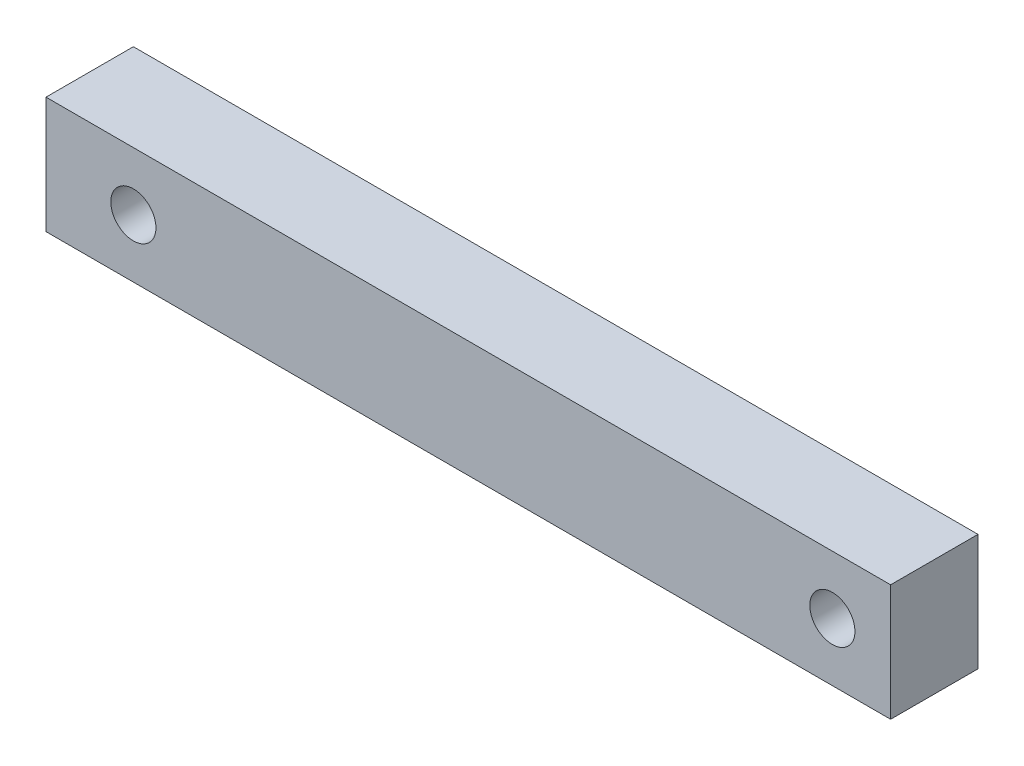
ISO-10303-21;
HEADER;
FILE_DESCRIPTION(('STEP AP214'),'2;1');
FILE_NAME('part.step','',(''),(''),'','','');
FILE_SCHEMA(('AUTOMOTIVE_DESIGN { 1 0 10303 214 1 1 1 1 }'));
ENDSEC;
DATA;
#1=APPLICATION_CONTEXT('core data for automotive mechanical design processes');
#2=APPLICATION_PROTOCOL_DEFINITION('international standard','automotive_design',2000,#1);
#3=PRODUCT_CONTEXT('',#1,'mechanical');
#4=PRODUCT('Part','Part','',(#3));
#5=PRODUCT_RELATED_PRODUCT_CATEGORY('part','',(#4));
#6=PRODUCT_DEFINITION_FORMATION('','',#4);
#7=PRODUCT_DEFINITION_CONTEXT('part definition',#1,'design');
#8=PRODUCT_DEFINITION('design','',#6,#7);
#9=PRODUCT_DEFINITION_SHAPE('','',#8);
#10=(LENGTH_UNIT() NAMED_UNIT(*) SI_UNIT(.MILLI.,.METRE.));
#11=(NAMED_UNIT(*) PLANE_ANGLE_UNIT() SI_UNIT($,.RADIAN.));
#12=(NAMED_UNIT(*) SI_UNIT($,.STERADIAN.) SOLID_ANGLE_UNIT());
#13=UNCERTAINTY_MEASURE_WITH_UNIT(LENGTH_MEASURE(1.E-05),#10,'distance_accuracy_value','');
#14=(GEOMETRIC_REPRESENTATION_CONTEXT(3) GLOBAL_UNCERTAINTY_ASSIGNED_CONTEXT((#13)) GLOBAL_UNIT_ASSIGNED_CONTEXT((#10,
#11,#12)) REPRESENTATION_CONTEXT('',''));
#15=CARTESIAN_POINT('',(0.,0.,0.));
#16=DIRECTION('',(0.,0.,1.));
#17=DIRECTION('',(1.,0.,0.));
#18=AXIS2_PLACEMENT_3D('',#15,#16,#17);
#19=CARTESIAN_POINT('',(34.9999999999999,-366.619505632495,6.));
#20=DIRECTION('',(1.,0.,0.));
#21=DIRECTION('',(0.,0.,-1.));
#22=AXIS2_PLACEMENT_3D('',#19,#20,#21);
#23=PLANE('',#22);
#24=DIRECTION('',(0.,-1.,0.));
#25=VECTOR('',#24,1.);
#26=CARTESIAN_POINT('',(34.9999999999999,-366.619505632495,0.));
#27=LINE('',#26,#25);
#28=CARTESIAN_POINT('',(34.9999999999999,-366.619505632495,0.));
#29=VERTEX_POINT('',#28);
#30=CARTESIAN_POINT('',(34.9999999999999,-374.619505632495,0.));
#31=VERTEX_POINT('',#30);
#32=EDGE_CURVE('E98',#29,#31,#27,.T.);
#33=ORIENTED_EDGE('',*,*,#32,.T.);
#34=DIRECTION('',(0.,0.,-1.));
#35=VECTOR('',#34,1.);
#36=CARTESIAN_POINT('',(34.9999999999999,-374.619505632495,6.));
#37=LINE('',#36,#35);
#38=CARTESIAN_POINT('',(34.9999999999999,-374.619505632495,6.));
#39=VERTEX_POINT('',#38);
#40=EDGE_CURVE('E11',#39,#31,#37,.T.);
#41=ORIENTED_EDGE('',*,*,#40,.F.);
#42=DIRECTION('',(0.,-1.,0.));
#43=VECTOR('',#42,1.);
#44=CARTESIAN_POINT('',(34.9999999999999,-366.619505632495,6.));
#45=LINE('',#44,#43);
#46=CARTESIAN_POINT('',(34.9999999999999,-366.619505632495,6.));
#47=VERTEX_POINT('',#46);
#48=EDGE_CURVE('E86',#47,#39,#45,.T.);
#49=ORIENTED_EDGE('',*,*,#48,.F.);
#50=DIRECTION('',(0.,0.,-1.));
#51=VECTOR('',#50,1.);
#52=CARTESIAN_POINT('',(34.9999999999999,-366.619505632495,6.));
#53=LINE('',#52,#51);
#54=EDGE_CURVE('E94',#47,#29,#53,.T.);
#55=ORIENTED_EDGE('',*,*,#54,.T.);
#56=EDGE_LOOP('',(#33,#41,#49,#55));
#57=FACE_BOUND('',#56,.T.);
#58=ADVANCED_FACE('F35',(#57),#23,.F.);
#59=CARTESIAN_POINT('',(34.9999999999999,-374.619505632495,6.));
#60=DIRECTION('',(0.,1.,0.));
#61=DIRECTION('',(0.,0.,1.));
#62=AXIS2_PLACEMENT_3D('',#59,#60,#61);
#63=PLANE('',#62);
#64=DIRECTION('',(1.,0.,0.));
#65=VECTOR('',#64,1.);
#66=CARTESIAN_POINT('',(34.9999999999999,-374.619505632495,0.));
#67=LINE('',#66,#65);
#68=CARTESIAN_POINT('',(92.9999999999999,-374.619505632495,0.));
#69=VERTEX_POINT('',#68);
#70=EDGE_CURVE('E90',#31,#69,#67,.T.);
#71=ORIENTED_EDGE('',*,*,#70,.T.);
#72=DIRECTION('',(0.,0.,-1.));
#73=VECTOR('',#72,1.);
#74=CARTESIAN_POINT('',(92.9999999999999,-374.619505632495,6.));
#75=LINE('',#74,#73);
#76=CARTESIAN_POINT('',(92.9999999999999,-374.619505632495,6.));
#77=VERTEX_POINT('',#76);
#78=EDGE_CURVE('E43',#77,#69,#75,.T.);
#79=ORIENTED_EDGE('',*,*,#78,.F.);
#80=DIRECTION('',(1.,0.,0.));
#81=VECTOR('',#80,1.);
#82=CARTESIAN_POINT('',(34.9999999999999,-374.619505632495,6.));
#83=LINE('',#82,#81);
#84=EDGE_CURVE('E81',#39,#77,#83,.T.);
#85=ORIENTED_EDGE('',*,*,#84,.F.);
#86=ORIENTED_EDGE('',*,*,#40,.T.);
#87=EDGE_LOOP('',(#71,#79,#85,#86));
#88=FACE_BOUND('',#87,.T.);
#89=ADVANCED_FACE('F89',(#88),#63,.F.);
#90=CARTESIAN_POINT('',(92.9999999999999,-366.619505632495,6.));
#91=DIRECTION('',(-1.,0.,0.));
#92=DIRECTION('',(0.,0.,1.));
#93=AXIS2_PLACEMENT_3D('',#90,#91,#92);
#94=PLANE('',#93);
#95=DIRECTION('',(0.,1.,0.));
#96=VECTOR('',#95,1.);
#97=CARTESIAN_POINT('',(92.9999999999999,-366.619505632495,0.));
#98=LINE('',#97,#96);
#99=CARTESIAN_POINT('',(92.9999999999999,-366.619505632495,0.));
#100=VERTEX_POINT('',#99);
#101=EDGE_CURVE('E68',#69,#100,#98,.T.);
#102=ORIENTED_EDGE('',*,*,#101,.T.);
#103=DIRECTION('',(0.,0.,-1.));
#104=VECTOR('',#103,1.);
#105=CARTESIAN_POINT('',(92.9999999999999,-366.619505632495,6.));
#106=LINE('',#105,#104);
#107=CARTESIAN_POINT('',(92.9999999999999,-366.619505632495,6.));
#108=VERTEX_POINT('',#107);
#109=EDGE_CURVE('E91',#108,#100,#106,.T.);
#110=ORIENTED_EDGE('',*,*,#109,.F.);
#111=DIRECTION('',(0.,1.,0.));
#112=VECTOR('',#111,1.);
#113=CARTESIAN_POINT('',(92.9999999999999,-366.619505632495,6.));
#114=LINE('',#113,#112);
#115=EDGE_CURVE('E84',#77,#108,#114,.T.);
#116=ORIENTED_EDGE('',*,*,#115,.F.);
#117=ORIENTED_EDGE('',*,*,#78,.T.);
#118=EDGE_LOOP('',(#102,#110,#116,#117));
#119=FACE_BOUND('',#118,.T.);
#120=ADVANCED_FACE('F92',(#119),#94,.F.);
#121=CARTESIAN_POINT('',(34.9999999999999,-366.619505632495,6.));
#122=DIRECTION('',(0.,-1.,0.));
#123=DIRECTION('',(0.,0.,-1.));
#124=AXIS2_PLACEMENT_3D('',#121,#122,#123);
#125=PLANE('',#124);
#126=DIRECTION('',(-1.,0.,0.));
#127=VECTOR('',#126,1.);
#128=CARTESIAN_POINT('',(34.9999999999999,-366.619505632495,0.));
#129=LINE('',#128,#127);
#130=EDGE_CURVE('E74',#100,#29,#129,.T.);
#131=ORIENTED_EDGE('',*,*,#130,.T.);
#132=ORIENTED_EDGE('',*,*,#54,.F.);
#133=DIRECTION('',(-1.,0.,0.));
#134=VECTOR('',#133,1.);
#135=CARTESIAN_POINT('',(34.9999999999999,-366.619505632495,6.));
#136=LINE('',#135,#134);
#137=EDGE_CURVE('E51',#108,#47,#136,.T.);
#138=ORIENTED_EDGE('',*,*,#137,.F.);
#139=ORIENTED_EDGE('',*,*,#109,.T.);
#140=EDGE_LOOP('',(#131,#132,#138,#139));
#141=FACE_BOUND('',#140,.T.);
#142=ADVANCED_FACE('F106',(#141),#125,.F.);
#143=CARTESIAN_POINT('',(0.,0.,6.));
#144=DIRECTION('',(0.,0.,1.));
#145=DIRECTION('',(1.,0.,0.));
#146=AXIS2_PLACEMENT_3D('',#143,#144,#145);
#147=PLANE('',#146);
#148=CARTESIAN_POINT('',(40.9999999999999,-370.619505632495,6.));
#149=DIRECTION('',(0.,0.,-1.));
#150=DIRECTION('',(-1.,0.,0.));
#151=AXIS2_PLACEMENT_3D('',#148,#149,#150);
#152=CIRCLE('',#151,1.55000000000003);
#153=CARTESIAN_POINT('',(39.4499999999999,-370.619505632495,6.));
#154=VERTEX_POINT('',#153);
#155=EDGE_CURVE('E115',#154,#154,#152,.T.);
#156=ORIENTED_EDGE('',*,*,#155,.T.);
#157=EDGE_LOOP('',(#156));
#158=FACE_BOUND('',#157,.T.);
#159=CARTESIAN_POINT('',(88.9999999999999,-370.619505632495,6.));
#160=DIRECTION('',(0.,0.,-1.));
#161=DIRECTION('',(-1.,0.,0.));
#162=AXIS2_PLACEMENT_3D('',#159,#160,#161);
#163=CIRCLE('',#162,1.55);
#164=CARTESIAN_POINT('',(87.4499999999999,-370.619505632495,6.));
#165=VERTEX_POINT('',#164);
#166=EDGE_CURVE('E101',#165,#165,#163,.T.);
#167=ORIENTED_EDGE('',*,*,#166,.T.);
#168=EDGE_LOOP('',(#167));
#169=FACE_BOUND('',#168,.T.);
#170=ORIENTED_EDGE('',*,*,#48,.T.);
#171=ORIENTED_EDGE('',*,*,#84,.T.);
#172=ORIENTED_EDGE('',*,*,#115,.T.);
#173=ORIENTED_EDGE('',*,*,#137,.T.);
#174=EDGE_LOOP('',(#170,#171,#172,#173));
#175=FACE_BOUND('',#174,.T.);
#176=ADVANCED_FACE('F82',(#158,#169,#175),#147,.T.);
#177=CARTESIAN_POINT('',(0.,0.,0.));
#178=DIRECTION('',(0.,0.,1.));
#179=DIRECTION('',(1.,0.,0.));
#180=AXIS2_PLACEMENT_3D('',#177,#178,#179);
#181=PLANE('',#180);
#182=CARTESIAN_POINT('',(40.9999999999999,-370.619505632495,0.));
#183=DIRECTION('',(0.,0.,-1.));
#184=DIRECTION('',(-1.,0.,0.));
#185=AXIS2_PLACEMENT_3D('',#182,#183,#184);
#186=CIRCLE('',#185,1.55000000000003);
#187=CARTESIAN_POINT('',(39.4499999999999,-370.619505632495,0.));
#188=VERTEX_POINT('',#187);
#189=EDGE_CURVE('E118',#188,#188,#186,.T.);
#190=ORIENTED_EDGE('',*,*,#189,.F.);
#191=EDGE_LOOP('',(#190));
#192=FACE_BOUND('',#191,.T.);
#193=CARTESIAN_POINT('',(88.9999999999999,-370.619505632495,0.));
#194=DIRECTION('',(0.,0.,-1.));
#195=DIRECTION('',(-1.,0.,0.));
#196=AXIS2_PLACEMENT_3D('',#193,#194,#195);
#197=CIRCLE('',#196,1.55);
#198=CARTESIAN_POINT('',(87.4499999999999,-370.619505632495,0.));
#199=VERTEX_POINT('',#198);
#200=EDGE_CURVE('E112',#199,#199,#197,.T.);
#201=ORIENTED_EDGE('',*,*,#200,.F.);
#202=EDGE_LOOP('',(#201));
#203=FACE_BOUND('',#202,.T.);
#204=ORIENTED_EDGE('',*,*,#32,.F.);
#205=ORIENTED_EDGE('',*,*,#130,.F.);
#206=ORIENTED_EDGE('',*,*,#101,.F.);
#207=ORIENTED_EDGE('',*,*,#70,.F.);
#208=EDGE_LOOP('',(#204,#205,#206,#207));
#209=FACE_BOUND('',#208,.T.);
#210=ADVANCED_FACE('F109',(#192,#203,#209),#181,.F.);
#211=CARTESIAN_POINT('',(88.9999999999999,-370.619505632495,6.));
#212=DIRECTION('',(0.,0.,-1.));
#213=DIRECTION('',(-1.,0.,0.));
#214=AXIS2_PLACEMENT_3D('',#211,#212,#213);
#215=CYLINDRICAL_SURFACE('',#214,1.55);
#216=ORIENTED_EDGE('',*,*,#166,.F.);
#217=EDGE_LOOP('',(#216));
#218=FACE_BOUND('',#217,.T.);
#219=ORIENTED_EDGE('',*,*,#200,.T.);
#220=EDGE_LOOP('',(#219));
#221=FACE_BOUND('',#220,.T.);
#222=ADVANCED_FACE('F129',(#218,#221),#215,.F.);
#223=CARTESIAN_POINT('',(40.9999999999999,-370.619505632495,6.));
#224=DIRECTION('',(0.,0.,-1.));
#225=DIRECTION('',(-1.,0.,0.));
#226=AXIS2_PLACEMENT_3D('',#223,#224,#225);
#227=CYLINDRICAL_SURFACE('',#226,1.55000000000003);
#228=ORIENTED_EDGE('',*,*,#155,.F.);
#229=EDGE_LOOP('',(#228));
#230=FACE_BOUND('',#229,.T.);
#231=ORIENTED_EDGE('',*,*,#189,.T.);
#232=EDGE_LOOP('',(#231));
#233=FACE_BOUND('',#232,.T.);
#234=ADVANCED_FACE('F126',(#230,#233),#227,.F.);
#235=CLOSED_SHELL('',(#58,#89,#120,#142,#176,#210,#222,#234));
#236=MANIFOLD_SOLID_BREP('B2',#235);
#237=ADVANCED_BREP_SHAPE_REPRESENTATION('',(#18,#236),#14);
#238=SHAPE_DEFINITION_REPRESENTATION(#9,#237);
ENDSEC;
END-ISO-10303-21;
